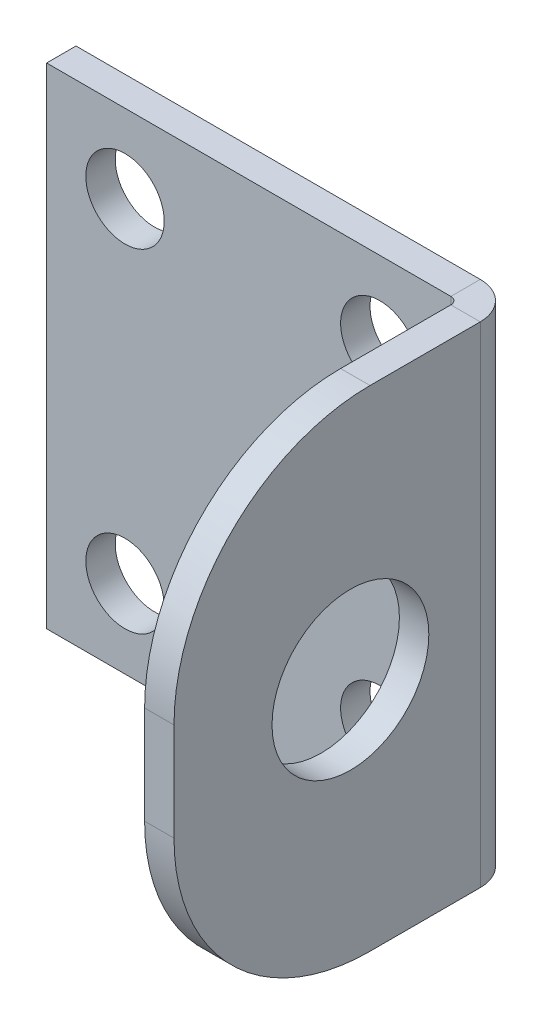
ISO-10303-21;
HEADER;
FILE_DESCRIPTION(('STEP AP214'),'2;1');
FILE_NAME('part.step','',(''),(''),'','','');
FILE_SCHEMA(('AUTOMOTIVE_DESIGN { 1 0 10303 214 1 1 1 1 }'));
ENDSEC;
DATA;
#1=APPLICATION_CONTEXT('core data for automotive mechanical design processes');
#2=APPLICATION_PROTOCOL_DEFINITION('international standard','automotive_design',2000,#1);
#3=PRODUCT_CONTEXT('',#1,'mechanical');
#4=PRODUCT('Part','Part','',(#3));
#5=PRODUCT_RELATED_PRODUCT_CATEGORY('part','',(#4));
#6=PRODUCT_DEFINITION_FORMATION('','',#4);
#7=PRODUCT_DEFINITION_CONTEXT('part definition',#1,'design');
#8=PRODUCT_DEFINITION('design','',#6,#7);
#9=PRODUCT_DEFINITION_SHAPE('','',#8);
#10=(LENGTH_UNIT() NAMED_UNIT(*) SI_UNIT(.MILLI.,.METRE.));
#11=(NAMED_UNIT(*) PLANE_ANGLE_UNIT() SI_UNIT($,.RADIAN.));
#12=(NAMED_UNIT(*) SI_UNIT($,.STERADIAN.) SOLID_ANGLE_UNIT());
#13=UNCERTAINTY_MEASURE_WITH_UNIT(LENGTH_MEASURE(1.E-05),#10,'distance_accuracy_value','');
#14=(GEOMETRIC_REPRESENTATION_CONTEXT(3) GLOBAL_UNCERTAINTY_ASSIGNED_CONTEXT((#13)) GLOBAL_UNIT_ASSIGNED_CONTEXT((#10,
#11,#12)) REPRESENTATION_CONTEXT('',''));
#15=CARTESIAN_POINT('',(0.,0.,0.));
#16=DIRECTION('',(0.,0.,1.));
#17=DIRECTION('',(1.,0.,0.));
#18=AXIS2_PLACEMENT_3D('',#15,#16,#17);
#19=CARTESIAN_POINT('',(0.,25.,3.75000000000002));
#20=DIRECTION('',(0.,1.,0.));
#21=DIRECTION('',(0.,0.,1.));
#22=AXIS2_PLACEMENT_3D('',#19,#20,#21);
#23=PLANE('',#22);
#24=DIRECTION('',(-1.,0.,0.));
#25=VECTOR('',#24,1.);
#26=CARTESIAN_POINT('',(0.,25.,3.75000000000002));
#27=LINE('',#26,#25);
#28=CARTESIAN_POINT('',(0.,25.,3.75000000000002));
#29=VERTEX_POINT('',#28);
#30=CARTESIAN_POINT('',(-2.99999999999995,25.,3.75000000000001));
#31=VERTEX_POINT('',#30);
#32=EDGE_CURVE('E228',#29,#31,#27,.T.);
#33=ORIENTED_EDGE('',*,*,#32,.F.);
#34=CARTESIAN_POINT('',(-3.74999999999996,25.,3.75000000000001));
#35=DIRECTION('',(0.,1.,0.));
#36=DIRECTION('',(0.,0.,1.));
#37=AXIS2_PLACEMENT_3D('',#34,#35,#36);
#38=CIRCLE('',#37,3.75);
#39=CARTESIAN_POINT('',(-3.74999999999998,25.,0.));
#40=VERTEX_POINT('',#39);
#41=EDGE_CURVE('E130',#40,#29,#38,.F.);
#42=ORIENTED_EDGE('',*,*,#41,.F.);
#43=DIRECTION('',(0.,0.,-1.));
#44=VECTOR('',#43,1.);
#45=CARTESIAN_POINT('',(-3.74999999999996,25.,3.00000000000001));
#46=LINE('',#45,#44);
#47=CARTESIAN_POINT('',(-3.74999999999996,25.,3.00000000000001));
#48=VERTEX_POINT('',#47);
#49=EDGE_CURVE('E225',#48,#40,#46,.T.);
#50=ORIENTED_EDGE('',*,*,#49,.F.);
#51=CARTESIAN_POINT('',(-3.74999999999996,25.,3.75000000000001));
#52=DIRECTION('',(0.,1.,0.));
#53=DIRECTION('',(1.,0.,0.));
#54=AXIS2_PLACEMENT_3D('',#51,#52,#53);
#55=CIRCLE('',#54,0.75);
#56=EDGE_CURVE('E202',#48,#31,#55,.F.);
#57=ORIENTED_EDGE('',*,*,#56,.T.);
#58=EDGE_LOOP('',(#33,#42,#50,#57));
#59=FACE_BOUND('',#58,.T.);
#60=ADVANCED_FACE('F43',(#59),#23,.T.);
#61=CARTESIAN_POINT('',(-3.74999999999996,25.,3.00000000000001));
#62=DIRECTION('',(0.,1.,0.));
#63=DIRECTION('',(0.,0.,1.));
#64=AXIS2_PLACEMENT_3D('',#61,#62,#63);
#65=PLANE('',#64);
#66=DIRECTION('',(0.,0.,1.));
#67=VECTOR('',#66,1.);
#68=CARTESIAN_POINT('',(-2.99999999999994,25.,0.));
#69=LINE('',#68,#67);
#70=CARTESIAN_POINT('',(-2.99999999999997,25.,15.));
#71=VERTEX_POINT('',#70);
#72=EDGE_CURVE('E182',#31,#71,#69,.T.);
#73=ORIENTED_EDGE('',*,*,#72,.T.);
#74=DIRECTION('',(-1.,0.,0.));
#75=VECTOR('',#74,1.);
#76=CARTESIAN_POINT('',(-3.74999999999999,25.,15.));
#77=LINE('',#76,#75);
#78=CARTESIAN_POINT('',(0.,25.,15.));
#79=VERTEX_POINT('',#78);
#80=EDGE_CURVE('E52',#71,#79,#77,.F.);
#81=ORIENTED_EDGE('',*,*,#80,.T.);
#82=DIRECTION('',(0.,0.,1.));
#83=VECTOR('',#82,1.);
#84=CARTESIAN_POINT('',(0.,25.,0.));
#85=LINE('',#84,#83);
#86=EDGE_CURVE('E185',#29,#79,#85,.T.);
#87=ORIENTED_EDGE('',*,*,#86,.F.);
#88=ORIENTED_EDGE('',*,*,#32,.T.);
#89=EDGE_LOOP('',(#73,#81,#87,#88));
#90=FACE_BOUND('',#89,.T.);
#91=ADVANCED_FACE('F289',(#90),#65,.T.);
#92=CARTESIAN_POINT('',(-2.99999999999994,25.,0.));
#93=DIRECTION('',(1.,0.,0.));
#94=DIRECTION('',(0.,0.,-1.));
#95=AXIS2_PLACEMENT_3D('',#92,#93,#94);
#96=PLANE('',#95);
#97=CARTESIAN_POINT('',(-2.99999999999998,0.,17.));
#98=DIRECTION('',(1.,0.,0.));
#99=DIRECTION('',(0.,0.,-1.));
#100=AXIS2_PLACEMENT_3D('',#97,#98,#99);
#101=CIRCLE('',#100,8.00000000000001);
#102=CARTESIAN_POINT('',(-2.99999999999997,0.,9.00000000000001));
#103=VERTEX_POINT('',#102);
#104=EDGE_CURVE('E354',#103,#103,#101,.T.);
#105=ORIENTED_EDGE('',*,*,#104,.T.);
#106=EDGE_LOOP('',(#105));
#107=FACE_BOUND('',#106,.T.);
#108=DIRECTION('',(0.,-1.,0.));
#109=VECTOR('',#108,1.);
#110=CARTESIAN_POINT('',(-3.,25.,35.));
#111=LINE('',#110,#109);
#112=CARTESIAN_POINT('',(-3.,5.,35.));
#113=VERTEX_POINT('',#112);
#114=CARTESIAN_POINT('',(-3.,-5.,35.));
#115=VERTEX_POINT('',#114);
#116=EDGE_CURVE('E222',#113,#115,#111,.T.);
#117=ORIENTED_EDGE('',*,*,#116,.F.);
#118=CARTESIAN_POINT('',(-2.99999999999997,5.,15.));
#119=DIRECTION('',(1.,0.,0.));
#120=DIRECTION('',(0.,0.,-1.));
#121=AXIS2_PLACEMENT_3D('',#118,#119,#120);
#122=CIRCLE('',#121,20.);
#123=EDGE_CURVE('E66',#113,#71,#122,.F.);
#124=ORIENTED_EDGE('',*,*,#123,.T.);
#125=ORIENTED_EDGE('',*,*,#72,.F.);
#126=DIRECTION('',(0.,-1.,0.));
#127=VECTOR('',#126,1.);
#128=CARTESIAN_POINT('',(-2.99999999999995,25.,3.75000000000001));
#129=LINE('',#128,#127);
#130=CARTESIAN_POINT('',(-2.99999999999995,-25.,3.75000000000001));
#131=VERTEX_POINT('',#130);
#132=EDGE_CURVE('E206',#31,#131,#129,.T.);
#133=ORIENTED_EDGE('',*,*,#132,.T.);
#134=DIRECTION('',(0.,0.,1.));
#135=VECTOR('',#134,1.);
#136=CARTESIAN_POINT('',(-2.99999999999994,-25.,0.));
#137=LINE('',#136,#135);
#138=CARTESIAN_POINT('',(-2.99999999999997,-25.,15.));
#139=VERTEX_POINT('',#138);
#140=EDGE_CURVE('E146',#131,#139,#137,.T.);
#141=ORIENTED_EDGE('',*,*,#140,.T.);
#142=CARTESIAN_POINT('',(-2.99999999999997,-5.,15.));
#143=DIRECTION('',(-1.,0.,0.));
#144=DIRECTION('',(0.,0.,-1.));
#145=AXIS2_PLACEMENT_3D('',#142,#143,#144);
#146=CIRCLE('',#145,20.);
#147=EDGE_CURVE('E169',#115,#139,#146,.F.);
#148=ORIENTED_EDGE('',*,*,#147,.F.);
#149=EDGE_LOOP('',(#117,#124,#125,#133,#141,#148));
#150=FACE_BOUND('',#149,.T.);
#151=ADVANCED_FACE('F270',(#107,#150),#96,.F.);
#152=CARTESIAN_POINT('',(0.,25.,35.));
#153=DIRECTION('',(0.,0.,1.));
#154=DIRECTION('',(1.,0.,0.));
#155=AXIS2_PLACEMENT_3D('',#152,#153,#154);
#156=PLANE('',#155);
#157=DIRECTION('',(0.,-1.,0.));
#158=VECTOR('',#157,1.);
#159=CARTESIAN_POINT('',(0.,25.,35.));
#160=LINE('',#159,#158);
#161=CARTESIAN_POINT('',(0.,5.,35.));
#162=VERTEX_POINT('',#161);
#163=CARTESIAN_POINT('',(0.,-5.,35.));
#164=VERTEX_POINT('',#163);
#165=EDGE_CURVE('E133',#162,#164,#160,.T.);
#166=ORIENTED_EDGE('',*,*,#165,.F.);
#167=DIRECTION('',(-1.,0.,0.));
#168=VECTOR('',#167,1.);
#169=CARTESIAN_POINT('',(0.,5.,35.));
#170=LINE('',#169,#168);
#171=EDGE_CURVE('E231',#162,#113,#170,.T.);
#172=ORIENTED_EDGE('',*,*,#171,.T.);
#173=ORIENTED_EDGE('',*,*,#116,.T.);
#174=DIRECTION('',(-1.,0.,0.));
#175=VECTOR('',#174,1.);
#176=CARTESIAN_POINT('',(0.,-5.,35.));
#177=LINE('',#176,#175);
#178=EDGE_CURVE('E163',#164,#115,#177,.T.);
#179=ORIENTED_EDGE('',*,*,#178,.F.);
#180=EDGE_LOOP('',(#166,#172,#173,#179));
#181=FACE_BOUND('',#180,.T.);
#182=ADVANCED_FACE('F265',(#181),#156,.T.);
#183=CARTESIAN_POINT('',(0.,25.,0.));
#184=DIRECTION('',(1.,0.,0.));
#185=DIRECTION('',(0.,0.,-1.));
#186=AXIS2_PLACEMENT_3D('',#183,#184,#185);
#187=PLANE('',#186);
#188=CARTESIAN_POINT('',(0.,0.,17.));
#189=DIRECTION('',(1.,0.,0.));
#190=DIRECTION('',(0.,0.,-1.));
#191=AXIS2_PLACEMENT_3D('',#188,#189,#190);
#192=CIRCLE('',#191,8.00000000000001);
#193=CARTESIAN_POINT('',(0.,0.,9.00000000000001));
#194=VERTEX_POINT('',#193);
#195=EDGE_CURVE('E358',#194,#194,#192,.T.);
#196=ORIENTED_EDGE('',*,*,#195,.F.);
#197=EDGE_LOOP('',(#196));
#198=FACE_BOUND('',#197,.T.);
#199=ORIENTED_EDGE('',*,*,#86,.T.);
#200=CARTESIAN_POINT('',(0.,5.,15.));
#201=DIRECTION('',(1.,0.,0.));
#202=DIRECTION('',(0.,0.,-1.));
#203=AXIS2_PLACEMENT_3D('',#200,#201,#202);
#204=CIRCLE('',#203,20.);
#205=EDGE_CURVE('E11',#79,#162,#204,.T.);
#206=ORIENTED_EDGE('',*,*,#205,.T.);
#207=ORIENTED_EDGE('',*,*,#165,.T.);
#208=CARTESIAN_POINT('',(0.,-5.,15.));
#209=DIRECTION('',(-1.,0.,0.));
#210=DIRECTION('',(0.,0.,-1.));
#211=AXIS2_PLACEMENT_3D('',#208,#209,#210);
#212=CIRCLE('',#211,20.);
#213=CARTESIAN_POINT('',(0.,-25.,15.));
#214=VERTEX_POINT('',#213);
#215=EDGE_CURVE('E140',#214,#164,#212,.T.);
#216=ORIENTED_EDGE('',*,*,#215,.F.);
#217=DIRECTION('',(0.,0.,1.));
#218=VECTOR('',#217,1.);
#219=CARTESIAN_POINT('',(0.,-25.,0.));
#220=LINE('',#219,#218);
#221=CARTESIAN_POINT('',(0.,-25.,3.75000000000002));
#222=VERTEX_POINT('',#221);
#223=EDGE_CURVE('E137',#222,#214,#220,.T.);
#224=ORIENTED_EDGE('',*,*,#223,.F.);
#225=DIRECTION('',(0.,-1.,0.));
#226=VECTOR('',#225,1.);
#227=CARTESIAN_POINT('',(0.,25.,3.75000000000002));
#228=LINE('',#227,#226);
#229=EDGE_CURVE('E122',#29,#222,#228,.T.);
#230=ORIENTED_EDGE('',*,*,#229,.F.);
#231=EDGE_LOOP('',(#199,#206,#207,#216,#224,#230));
#232=FACE_BOUND('',#231,.T.);
#233=ADVANCED_FACE('F138',(#198,#232),#187,.T.);
#234=CARTESIAN_POINT('',(-3.74999999999996,25.,3.75000000000001));
#235=DIRECTION('',(0.,-1.,0.));
#236=DIRECTION('',(0.,0.,-1.));
#237=AXIS2_PLACEMENT_3D('',#234,#235,#236);
#238=CYLINDRICAL_SURFACE('',#237,3.75);
#239=ORIENTED_EDGE('',*,*,#229,.T.);
#240=CARTESIAN_POINT('',(-3.74999999999996,-25.,3.75000000000001));
#241=DIRECTION('',(0.,1.,0.));
#242=DIRECTION('',(0.,0.,1.));
#243=AXIS2_PLACEMENT_3D('',#240,#241,#242);
#244=CIRCLE('',#243,3.75);
#245=CARTESIAN_POINT('',(-3.74999999999998,-25.,0.));
#246=VERTEX_POINT('',#245);
#247=EDGE_CURVE('E127',#246,#222,#244,.F.);
#248=ORIENTED_EDGE('',*,*,#247,.F.);
#249=DIRECTION('',(0.,-1.,0.));
#250=VECTOR('',#249,1.);
#251=CARTESIAN_POINT('',(-3.74999999999998,25.,0.));
#252=LINE('',#251,#250);
#253=EDGE_CURVE('E134',#40,#246,#252,.T.);
#254=ORIENTED_EDGE('',*,*,#253,.F.);
#255=ORIENTED_EDGE('',*,*,#41,.T.);
#256=EDGE_LOOP('',(#239,#248,#254,#255));
#257=FACE_BOUND('',#256,.T.);
#258=ADVANCED_FACE('F124',(#257),#238,.T.);
#259=CARTESIAN_POINT('',(-44.9999999999999,25.,0.));
#260=DIRECTION('',(0.,0.,-1.));
#261=DIRECTION('',(-1.,0.,0.));
#262=AXIS2_PLACEMENT_3D('',#259,#260,#261);
#263=PLANE('',#262);
#264=CARTESIAN_POINT('',(-36.9999999999999,-17.,0.));
#265=DIRECTION('',(0.,0.,1.));
#266=DIRECTION('',(1.,0.,0.));
#267=AXIS2_PLACEMENT_3D('',#264,#265,#266);
#268=CIRCLE('',#267,4.00000000000001);
#269=CARTESIAN_POINT('',(-32.9999999999999,-17.,0.));
#270=VERTEX_POINT('',#269);
#271=EDGE_CURVE('E375',#270,#270,#268,.T.);
#272=ORIENTED_EDGE('',*,*,#271,.T.);
#273=EDGE_LOOP('',(#272));
#274=FACE_BOUND('',#273,.T.);
#275=CARTESIAN_POINT('',(-11.,-17.,0.));
#276=DIRECTION('',(0.,0.,1.));
#277=DIRECTION('',(1.,0.,0.));
#278=AXIS2_PLACEMENT_3D('',#275,#276,#277);
#279=CIRCLE('',#278,4.);
#280=CARTESIAN_POINT('',(-7.,-17.,0.));
#281=VERTEX_POINT('',#280);
#282=EDGE_CURVE('E383',#281,#281,#279,.T.);
#283=ORIENTED_EDGE('',*,*,#282,.T.);
#284=EDGE_LOOP('',(#283));
#285=FACE_BOUND('',#284,.T.);
#286=CARTESIAN_POINT('',(-11.,17.,0.));
#287=DIRECTION('',(0.,0.,1.));
#288=DIRECTION('',(1.,0.,0.));
#289=AXIS2_PLACEMENT_3D('',#286,#287,#288);
#290=CIRCLE('',#289,4.);
#291=CARTESIAN_POINT('',(-7.,17.,0.));
#292=VERTEX_POINT('',#291);
#293=EDGE_CURVE('E367',#292,#292,#290,.T.);
#294=ORIENTED_EDGE('',*,*,#293,.T.);
#295=EDGE_LOOP('',(#294));
#296=FACE_BOUND('',#295,.T.);
#297=CARTESIAN_POINT('',(-36.9999999999999,17.,0.));
#298=DIRECTION('',(0.,0.,1.));
#299=DIRECTION('',(1.,0.,0.));
#300=AXIS2_PLACEMENT_3D('',#297,#298,#299);
#301=CIRCLE('',#300,4.);
#302=CARTESIAN_POINT('',(-32.9999999999999,17.,0.));
#303=VERTEX_POINT('',#302);
#304=EDGE_CURVE('E362',#303,#303,#301,.T.);
#305=ORIENTED_EDGE('',*,*,#304,.T.);
#306=EDGE_LOOP('',(#305));
#307=FACE_BOUND('',#306,.T.);
#308=ORIENTED_EDGE('',*,*,#253,.T.);
#309=DIRECTION('',(1.,0.,0.));
#310=VECTOR('',#309,1.);
#311=CARTESIAN_POINT('',(-44.9999999999999,-25.,0.));
#312=LINE('',#311,#310);
#313=CARTESIAN_POINT('',(-44.9999999999999,-25.,0.));
#314=VERTEX_POINT('',#313);
#315=EDGE_CURVE('E156',#314,#246,#312,.T.);
#316=ORIENTED_EDGE('',*,*,#315,.F.);
#317=DIRECTION('',(0.,-1.,0.));
#318=VECTOR('',#317,1.);
#319=CARTESIAN_POINT('',(-44.9999999999999,25.,0.));
#320=LINE('',#319,#318);
#321=CARTESIAN_POINT('',(-44.9999999999999,25.,0.));
#322=VERTEX_POINT('',#321);
#323=EDGE_CURVE('E215',#322,#314,#320,.T.);
#324=ORIENTED_EDGE('',*,*,#323,.F.);
#325=DIRECTION('',(1.,0.,0.));
#326=VECTOR('',#325,1.);
#327=CARTESIAN_POINT('',(-44.9999999999999,25.,0.));
#328=LINE('',#327,#326);
#329=EDGE_CURVE('E190',#322,#40,#328,.T.);
#330=ORIENTED_EDGE('',*,*,#329,.T.);
#331=EDGE_LOOP('',(#308,#316,#324,#330));
#332=FACE_BOUND('',#331,.T.);
#333=ADVANCED_FACE('F306',(#274,#285,#296,#307,#332),#263,.T.);
#334=CARTESIAN_POINT('',(-44.9999999999999,25.,3.));
#335=DIRECTION('',(-1.,0.,0.));
#336=DIRECTION('',(0.,0.,1.));
#337=AXIS2_PLACEMENT_3D('',#334,#335,#336);
#338=PLANE('',#337);
#339=ORIENTED_EDGE('',*,*,#323,.T.);
#340=DIRECTION('',(0.,0.,-1.));
#341=VECTOR('',#340,1.);
#342=CARTESIAN_POINT('',(-44.9999999999999,-25.,3.));
#343=LINE('',#342,#341);
#344=CARTESIAN_POINT('',(-44.9999999999999,-25.,3.));
#345=VERTEX_POINT('',#344);
#346=EDGE_CURVE('E342',#345,#314,#343,.T.);
#347=ORIENTED_EDGE('',*,*,#346,.F.);
#348=DIRECTION('',(0.,-1.,0.));
#349=VECTOR('',#348,1.);
#350=CARTESIAN_POINT('',(-44.9999999999999,25.,3.));
#351=LINE('',#350,#349);
#352=CARTESIAN_POINT('',(-44.9999999999999,25.,3.));
#353=VERTEX_POINT('',#352);
#354=EDGE_CURVE('E212',#353,#345,#351,.T.);
#355=ORIENTED_EDGE('',*,*,#354,.F.);
#356=DIRECTION('',(0.,0.,-1.));
#357=VECTOR('',#356,1.);
#358=CARTESIAN_POINT('',(-44.9999999999999,25.,3.));
#359=LINE('',#358,#357);
#360=EDGE_CURVE('E194',#353,#322,#359,.T.);
#361=ORIENTED_EDGE('',*,*,#360,.T.);
#362=EDGE_LOOP('',(#339,#347,#355,#361));
#363=FACE_BOUND('',#362,.T.);
#364=ADVANCED_FACE('F309',(#363),#338,.T.);
#365=CARTESIAN_POINT('',(-44.9999999999999,25.,3.));
#366=DIRECTION('',(0.,0.,-1.));
#367=DIRECTION('',(-1.,0.,0.));
#368=AXIS2_PLACEMENT_3D('',#365,#366,#367);
#369=PLANE('',#368);
#370=CARTESIAN_POINT('',(-36.9999999999999,-17.,3.00000000000001));
#371=DIRECTION('',(0.,0.,1.));
#372=DIRECTION('',(1.,0.,0.));
#373=AXIS2_PLACEMENT_3D('',#370,#371,#372);
#374=CIRCLE('',#373,4.00000000000001);
#375=CARTESIAN_POINT('',(-32.9999999999999,-17.,3.00000000000001));
#376=VERTEX_POINT('',#375);
#377=EDGE_CURVE('E371',#376,#376,#374,.T.);
#378=ORIENTED_EDGE('',*,*,#377,.F.);
#379=EDGE_LOOP('',(#378));
#380=FACE_BOUND('',#379,.T.);
#381=CARTESIAN_POINT('',(-11.,-17.,3.00000000000001));
#382=DIRECTION('',(0.,0.,1.));
#383=DIRECTION('',(1.,0.,0.));
#384=AXIS2_PLACEMENT_3D('',#381,#382,#383);
#385=CIRCLE('',#384,4.);
#386=CARTESIAN_POINT('',(-7.,-17.,3.00000000000001));
#387=VERTEX_POINT('',#386);
#388=EDGE_CURVE('E379',#387,#387,#385,.T.);
#389=ORIENTED_EDGE('',*,*,#388,.F.);
#390=EDGE_LOOP('',(#389));
#391=FACE_BOUND('',#390,.T.);
#392=CARTESIAN_POINT('',(-11.,17.,3.00000000000001));
#393=DIRECTION('',(0.,0.,1.));
#394=DIRECTION('',(1.,0.,0.));
#395=AXIS2_PLACEMENT_3D('',#392,#393,#394);
#396=CIRCLE('',#395,4.);
#397=CARTESIAN_POINT('',(-7.,17.,3.00000000000001));
#398=VERTEX_POINT('',#397);
#399=EDGE_CURVE('E387',#398,#398,#396,.T.);
#400=ORIENTED_EDGE('',*,*,#399,.F.);
#401=EDGE_LOOP('',(#400));
#402=FACE_BOUND('',#401,.T.);
#403=CARTESIAN_POINT('',(-36.9999999999999,17.,3.00000000000001));
#404=DIRECTION('',(0.,0.,1.));
#405=DIRECTION('',(1.,0.,0.));
#406=AXIS2_PLACEMENT_3D('',#403,#404,#405);
#407=CIRCLE('',#406,4.);
#408=CARTESIAN_POINT('',(-32.9999999999999,17.,3.00000000000001));
#409=VERTEX_POINT('',#408);
#410=EDGE_CURVE('E363',#409,#409,#407,.T.);
#411=ORIENTED_EDGE('',*,*,#410,.F.);
#412=EDGE_LOOP('',(#411));
#413=FACE_BOUND('',#412,.T.);
#414=ORIENTED_EDGE('',*,*,#354,.T.);
#415=DIRECTION('',(1.,0.,0.));
#416=VECTOR('',#415,1.);
#417=CARTESIAN_POINT('',(-44.9999999999999,-25.,3.));
#418=LINE('',#417,#416);
#419=CARTESIAN_POINT('',(-3.74999999999996,-25.,3.00000000000001));
#420=VERTEX_POINT('',#419);
#421=EDGE_CURVE('E335',#345,#420,#418,.T.);
#422=ORIENTED_EDGE('',*,*,#421,.T.);
#423=DIRECTION('',(0.,-1.,0.));
#424=VECTOR('',#423,1.);
#425=CARTESIAN_POINT('',(-3.74999999999996,25.,3.00000000000001));
#426=LINE('',#425,#424);
#427=EDGE_CURVE('E209',#48,#420,#426,.T.);
#428=ORIENTED_EDGE('',*,*,#427,.F.);
#429=DIRECTION('',(1.,0.,0.));
#430=VECTOR('',#429,1.);
#431=CARTESIAN_POINT('',(-44.9999999999999,25.,3.));
#432=LINE('',#431,#430);
#433=EDGE_CURVE('E198',#353,#48,#432,.T.);
#434=ORIENTED_EDGE('',*,*,#433,.F.);
#435=EDGE_LOOP('',(#414,#422,#428,#434));
#436=FACE_BOUND('',#435,.T.);
#437=ADVANCED_FACE('F313',(#380,#391,#402,#413,#436),#369,.F.);
#438=CARTESIAN_POINT('',(-3.74999999999996,25.,3.75000000000001));
#439=DIRECTION('',(0.,-1.,0.));
#440=DIRECTION('',(0.,0.,-1.));
#441=AXIS2_PLACEMENT_3D('',#438,#439,#440);
#442=CYLINDRICAL_SURFACE('',#441,0.75);
#443=ORIENTED_EDGE('',*,*,#427,.T.);
#444=CARTESIAN_POINT('',(-3.74999999999996,-25.,3.75000000000001));
#445=DIRECTION('',(0.,1.,0.));
#446=DIRECTION('',(1.,0.,0.));
#447=AXIS2_PLACEMENT_3D('',#444,#445,#446);
#448=CIRCLE('',#447,0.75);
#449=EDGE_CURVE('E171',#420,#131,#448,.F.);
#450=ORIENTED_EDGE('',*,*,#449,.T.);
#451=ORIENTED_EDGE('',*,*,#132,.F.);
#452=ORIENTED_EDGE('',*,*,#56,.F.);
#453=EDGE_LOOP('',(#443,#450,#451,#452));
#454=FACE_BOUND('',#453,.T.);
#455=ADVANCED_FACE('F317',(#454),#442,.F.);
#456=CARTESIAN_POINT('',(-3.74999999999996,25.,3.75000000000001));
#457=DIRECTION('',(0.,1.,0.));
#458=DIRECTION('',(1.,0.,0.));
#459=AXIS2_PLACEMENT_3D('',#456,#457,#458);
#460=PLANE('',#459);
#461=ORIENTED_EDGE('',*,*,#433,.T.);
#462=ORIENTED_EDGE('',*,*,#49,.T.);
#463=ORIENTED_EDGE('',*,*,#329,.F.);
#464=ORIENTED_EDGE('',*,*,#360,.F.);
#465=EDGE_LOOP('',(#461,#462,#463,#464));
#466=FACE_BOUND('',#465,.T.);
#467=ADVANCED_FACE('F320',(#466),#460,.T.);
#468=CARTESIAN_POINT('',(0.,5.,15.));
#469=DIRECTION('',(-1.,0.,0.));
#470=DIRECTION('',(0.,0.,1.));
#471=AXIS2_PLACEMENT_3D('',#468,#469,#470);
#472=CYLINDRICAL_SURFACE('',#471,20.);
#473=ORIENTED_EDGE('',*,*,#205,.F.);
#474=ORIENTED_EDGE('',*,*,#80,.F.);
#475=ORIENTED_EDGE('',*,*,#123,.F.);
#476=ORIENTED_EDGE('',*,*,#171,.F.);
#477=EDGE_LOOP('',(#473,#474,#475,#476));
#478=FACE_BOUND('',#477,.T.);
#479=ADVANCED_FACE('F45',(#478),#472,.T.);
#480=CARTESIAN_POINT('',(0.,-25.,3.75000000000002));
#481=DIRECTION('',(0.,-1.,0.));
#482=DIRECTION('',(0.,0.,1.));
#483=AXIS2_PLACEMENT_3D('',#480,#481,#482);
#484=PLANE('',#483);
#485=DIRECTION('',(-1.,0.,0.));
#486=VECTOR('',#485,1.);
#487=CARTESIAN_POINT('',(0.,-25.,3.75000000000002));
#488=LINE('',#487,#486);
#489=EDGE_CURVE('E152',#222,#131,#488,.T.);
#490=ORIENTED_EDGE('',*,*,#489,.T.);
#491=ORIENTED_EDGE('',*,*,#449,.F.);
#492=DIRECTION('',(0.,0.,-1.));
#493=VECTOR('',#492,1.);
#494=CARTESIAN_POINT('',(-3.74999999999996,-25.,3.00000000000001));
#495=LINE('',#494,#493);
#496=EDGE_CURVE('E154',#420,#246,#495,.T.);
#497=ORIENTED_EDGE('',*,*,#496,.T.);
#498=ORIENTED_EDGE('',*,*,#247,.T.);
#499=EDGE_LOOP('',(#490,#491,#497,#498));
#500=FACE_BOUND('',#499,.T.);
#501=ADVANCED_FACE('F150',(#500),#484,.T.);
#502=CARTESIAN_POINT('',(-3.74999999999996,-25.,3.00000000000001));
#503=DIRECTION('',(0.,-1.,0.));
#504=DIRECTION('',(0.,0.,1.));
#505=AXIS2_PLACEMENT_3D('',#502,#503,#504);
#506=PLANE('',#505);
#507=ORIENTED_EDGE('',*,*,#140,.F.);
#508=ORIENTED_EDGE('',*,*,#489,.F.);
#509=ORIENTED_EDGE('',*,*,#223,.T.);
#510=DIRECTION('',(-1.,0.,0.));
#511=VECTOR('',#510,1.);
#512=CARTESIAN_POINT('',(-3.74999999999999,-25.,15.));
#513=LINE('',#512,#511);
#514=EDGE_CURVE('E177',#139,#214,#513,.F.);
#515=ORIENTED_EDGE('',*,*,#514,.F.);
#516=EDGE_LOOP('',(#507,#508,#509,#515));
#517=FACE_BOUND('',#516,.T.);
#518=ADVANCED_FACE('F159',(#517),#506,.T.);
#519=CARTESIAN_POINT('',(-3.74999999999996,-25.,3.75000000000001));
#520=DIRECTION('',(0.,-1.,0.));
#521=DIRECTION('',(1.,0.,0.));
#522=AXIS2_PLACEMENT_3D('',#519,#520,#521);
#523=PLANE('',#522);
#524=ORIENTED_EDGE('',*,*,#421,.F.);
#525=ORIENTED_EDGE('',*,*,#346,.T.);
#526=ORIENTED_EDGE('',*,*,#315,.T.);
#527=ORIENTED_EDGE('',*,*,#496,.F.);
#528=EDGE_LOOP('',(#524,#525,#526,#527));
#529=FACE_BOUND('',#528,.T.);
#530=ADVANCED_FACE('F275',(#529),#523,.T.);
#531=CARTESIAN_POINT('',(0.,-5.,15.));
#532=DIRECTION('',(-1.,0.,0.));
#533=DIRECTION('',(0.,0.,1.));
#534=AXIS2_PLACEMENT_3D('',#531,#532,#533);
#535=CYLINDRICAL_SURFACE('',#534,20.);
#536=ORIENTED_EDGE('',*,*,#215,.T.);
#537=ORIENTED_EDGE('',*,*,#178,.T.);
#538=ORIENTED_EDGE('',*,*,#147,.T.);
#539=ORIENTED_EDGE('',*,*,#514,.T.);
#540=EDGE_LOOP('',(#536,#537,#538,#539));
#541=FACE_BOUND('',#540,.T.);
#542=ADVANCED_FACE('F272',(#541),#535,.T.);
#543=CARTESIAN_POINT('',(-45.,0.,17.0000000000001));
#544=DIRECTION('',(1.,0.,0.));
#545=DIRECTION('',(0.,0.,-1.));
#546=AXIS2_PLACEMENT_3D('',#543,#544,#545);
#547=CYLINDRICAL_SURFACE('',#546,8.00000000000001);
#548=CARTESIAN_POINT('',(0.,0.,9.00000000000001));
#549=CARTESIAN_POINT('',(-0.0312499999999919,0.,9.00000000000001));
#550=CARTESIAN_POINT('',(-0.0624999999999908,0.,9.00000000000001));
#551=CARTESIAN_POINT('',(-0.124999999999991,0.,9.00000000000001));
#552=CARTESIAN_POINT('',(-0.156249999999992,0.,9.00000000000001));
#553=CARTESIAN_POINT('',(-0.218749999999992,0.,9.00000000000001));
#554=CARTESIAN_POINT('',(-0.249999999999991,0.,9.00000000000001));
#555=CARTESIAN_POINT('',(-0.312499999999991,0.,9.00000000000001));
#556=CARTESIAN_POINT('',(-0.343749999999992,0.,9.00000000000001));
#557=CARTESIAN_POINT('',(-0.406249999999992,0.,9.00000000000001));
#558=CARTESIAN_POINT('',(-0.437499999999991,0.,9.00000000000001));
#559=CARTESIAN_POINT('',(-0.499999999999989,0.,9.00000000000001));
#560=CARTESIAN_POINT('',(-0.531249999999988,0.,9.00000000000001));
#561=CARTESIAN_POINT('',(-0.593749999999988,0.,9.00000000000001));
#562=CARTESIAN_POINT('',(-0.624999999999989,0.,9.00000000000001));
#563=CARTESIAN_POINT('',(-0.687499999999989,0.,9.00000000000001));
#564=CARTESIAN_POINT('',(-0.718749999999988,0.,9.00000000000001));
#565=CARTESIAN_POINT('',(-0.781249999999986,0.,9.00000000000001));
#566=CARTESIAN_POINT('',(-0.812499999999985,0.,9.00000000000001));
#567=CARTESIAN_POINT('',(-0.874999999999985,0.,9.00000000000001));
#568=CARTESIAN_POINT('',(-0.906249999999986,0.,9.00000000000001));
#569=CARTESIAN_POINT('',(-0.968749999999986,0.,9.00000000000001));
#570=CARTESIAN_POINT('',(-0.999999999999985,0.,9.00000000000001));
#571=CARTESIAN_POINT('',(-1.06249999999998,0.,9.00000000000001));
#572=CARTESIAN_POINT('',(-1.09374999999998,0.,9.00000000000001));
#573=CARTESIAN_POINT('',(-1.15624999999998,0.,9.00000000000001));
#574=CARTESIAN_POINT('',(-1.18749999999998,0.,9.00000000000001));
#575=CARTESIAN_POINT('',(-1.24999999999998,0.,9.00000000000001));
#576=CARTESIAN_POINT('',(-1.28124999999998,0.,9.00000000000001));
#577=CARTESIAN_POINT('',(-1.34374999999998,0.,9.00000000000001));
#578=CARTESIAN_POINT('',(-1.37499999999998,0.,9.00000000000001));
#579=CARTESIAN_POINT('',(-1.43749999999998,0.,9.00000000000001));
#580=CARTESIAN_POINT('',(-1.46874999999998,0.,9.00000000000001));
#581=CARTESIAN_POINT('',(-1.53124999999998,0.,9.00000000000001));
#582=CARTESIAN_POINT('',(-1.56249999999998,0.,9.00000000000001));
#583=CARTESIAN_POINT('',(-1.62499999999998,0.,9.00000000000001));
#584=CARTESIAN_POINT('',(-1.65624999999998,0.,9.00000000000001));
#585=CARTESIAN_POINT('',(-1.71874999999998,0.,9.00000000000001));
#586=CARTESIAN_POINT('',(-1.74999999999998,0.,9.00000000000001));
#587=CARTESIAN_POINT('',(-1.81249999999998,0.,9.00000000000001));
#588=CARTESIAN_POINT('',(-1.84374999999998,0.,9.00000000000001));
#589=CARTESIAN_POINT('',(-1.90624999999998,0.,9.00000000000001));
#590=CARTESIAN_POINT('',(-1.93749999999998,0.,9.00000000000001));
#591=CARTESIAN_POINT('',(-1.99999999999998,0.,9.00000000000001));
#592=CARTESIAN_POINT('',(-2.03124999999998,0.,9.00000000000001));
#593=CARTESIAN_POINT('',(-2.09374999999998,0.,9.00000000000001));
#594=CARTESIAN_POINT('',(-2.12499999999998,0.,9.00000000000001));
#595=CARTESIAN_POINT('',(-2.18749999999998,0.,9.00000000000001));
#596=CARTESIAN_POINT('',(-2.21874999999998,0.,9.00000000000001));
#597=CARTESIAN_POINT('',(-2.28124999999997,0.,9.00000000000001));
#598=CARTESIAN_POINT('',(-2.31249999999997,0.,9.00000000000001));
#599=CARTESIAN_POINT('',(-2.37499999999997,0.,9.00000000000001));
#600=CARTESIAN_POINT('',(-2.40624999999997,0.,9.00000000000001));
#601=CARTESIAN_POINT('',(-2.46874999999997,0.,9.00000000000001));
#602=CARTESIAN_POINT('',(-2.49999999999997,0.,9.00000000000001));
#603=CARTESIAN_POINT('',(-2.56249999999997,0.,9.00000000000001));
#604=CARTESIAN_POINT('',(-2.59374999999997,0.,9.00000000000001));
#605=CARTESIAN_POINT('',(-2.65624999999997,0.,9.00000000000001));
#606=CARTESIAN_POINT('',(-2.68749999999997,0.,9.00000000000001));
#607=CARTESIAN_POINT('',(-2.74999999999997,0.,9.00000000000001));
#608=CARTESIAN_POINT('',(-2.78124999999997,0.,9.00000000000001));
#609=CARTESIAN_POINT('',(-2.84374999999997,0.,9.00000000000001));
#610=CARTESIAN_POINT('',(-2.87499999999997,0.,9.00000000000001));
#611=CARTESIAN_POINT('',(-2.93749999999997,0.,9.00000000000001));
#612=CARTESIAN_POINT('',(-2.96874999999997,0.,9.00000000000001));
#613=CARTESIAN_POINT('',(-2.99999999999997,0.,9.00000000000001));
#614=B_SPLINE_CURVE_WITH_KNOTS('',3,(#548,#549,#550,#551,#552,#553,#554,#555,#556,#557,#558,
#559,#560,#561,#562,#563,#564,#565,#566,#567,#568,#569,#570,#571,#572,#573,#574,#575,#576,#577,
#578,#579,#580,#581,#582,#583,#584,#585,#586,#587,#588,#589,#590,#591,#592,#593,#594,#595,#596,
#597,#598,#599,#600,#601,#602,#603,#604,#605,#606,#607,#608,#609,#610,#611,#612,#613),
.UNSPECIFIED.,.F.,.F.,(4,2,2,2,2,2,2,2,2,2,2,2,2,2,2,2,2,2,2,2,2,2,2,2,2,2,2,2,2,2,2,2,4),(0.,
0.0937499999999966,0.1875,0.281249999999997,0.375,0.468749999999997,0.562499999999994,
0.656249999999997,0.749999999999994,0.84374999999999,0.937499999999994,1.03124999999999,
1.12499999999999,1.21874999999999,1.31249999999999,1.40624999999999,1.49999999999999,
1.59374999999998,1.68749999999999,1.78124999999998,1.87499999999999,1.96874999999998,
2.06249999999998,2.15624999999998,2.24999999999998,2.34374999999998,2.43749999999998,
2.53124999999998,2.62499999999997,2.71874999999998,2.81249999999997,2.90624999999998,
2.99999999999998),.UNSPECIFIED.);
#615=EDGE_CURVE('BSEAM274',#194,#103,#614,.T.);
#616=ORIENTED_EDGE('',*,*,#195,.T.);
#617=ORIENTED_EDGE('',*,*,#104,.F.);
#618=ORIENTED_EDGE('',*,*,#615,.T.);
#619=ORIENTED_EDGE('',*,*,#615,.F.);
#620=EDGE_LOOP('',(#616,#618,#617,#619));
#621=FACE_BOUND('',#620,.T.);
#622=ADVANCED_FACE('F274',(#621),#547,.F.);
#623=CARTESIAN_POINT('',(-36.9999999999999,17.,0.));
#624=DIRECTION('',(0.,0.,1.));
#625=DIRECTION('',(1.,0.,0.));
#626=AXIS2_PLACEMENT_3D('',#623,#624,#625);
#627=CYLINDRICAL_SURFACE('',#626,4.);
#628=ORIENTED_EDGE('',*,*,#304,.F.);
#629=EDGE_LOOP('',(#628));
#630=FACE_BOUND('',#629,.T.);
#631=ORIENTED_EDGE('',*,*,#410,.T.);
#632=EDGE_LOOP('',(#631));
#633=FACE_BOUND('',#632,.T.);
#634=ADVANCED_FACE('F281',(#630,#633),#627,.F.);
#635=CARTESIAN_POINT('',(-11.,17.,0.));
#636=DIRECTION('',(0.,0.,1.));
#637=DIRECTION('',(1.,0.,0.));
#638=AXIS2_PLACEMENT_3D('',#635,#636,#637);
#639=CYLINDRICAL_SURFACE('',#638,4.);
#640=ORIENTED_EDGE('',*,*,#293,.F.);
#641=EDGE_LOOP('',(#640));
#642=FACE_BOUND('',#641,.T.);
#643=ORIENTED_EDGE('',*,*,#399,.T.);
#644=EDGE_LOOP('',(#643));
#645=FACE_BOUND('',#644,.T.);
#646=ADVANCED_FACE('F398',(#642,#645),#639,.F.);
#647=CARTESIAN_POINT('',(-11.,-17.,0.));
#648=DIRECTION('',(0.,0.,1.));
#649=DIRECTION('',(1.,0.,0.));
#650=AXIS2_PLACEMENT_3D('',#647,#648,#649);
#651=CYLINDRICAL_SURFACE('',#650,4.);
#652=ORIENTED_EDGE('',*,*,#282,.F.);
#653=EDGE_LOOP('',(#652));
#654=FACE_BOUND('',#653,.T.);
#655=ORIENTED_EDGE('',*,*,#388,.T.);
#656=EDGE_LOOP('',(#655));
#657=FACE_BOUND('',#656,.T.);
#658=ADVANCED_FACE('F401',(#654,#657),#651,.F.);
#659=CARTESIAN_POINT('',(-36.9999999999999,-17.,0.));
#660=DIRECTION('',(0.,0.,1.));
#661=DIRECTION('',(1.,0.,0.));
#662=AXIS2_PLACEMENT_3D('',#659,#660,#661);
#663=CYLINDRICAL_SURFACE('',#662,4.00000000000001);
#664=ORIENTED_EDGE('',*,*,#271,.F.);
#665=EDGE_LOOP('',(#664));
#666=FACE_BOUND('',#665,.T.);
#667=ORIENTED_EDGE('',*,*,#377,.T.);
#668=EDGE_LOOP('',(#667));
#669=FACE_BOUND('',#668,.T.);
#670=ADVANCED_FACE('F415',(#666,#669),#663,.F.);
#671=CLOSED_SHELL('',(#60,#91,#151,#182,#233,#258,#333,#364,#437,#455,#467,#479,#501,#518,#530,
#542,#622,#634,#646,#658,#670));
#672=MANIFOLD_SOLID_BREP('B2',#671);
#673=ADVANCED_BREP_SHAPE_REPRESENTATION('',(#18,#672),#14);
#674=SHAPE_DEFINITION_REPRESENTATION(#9,#673);
ENDSEC;
END-ISO-10303-21;
